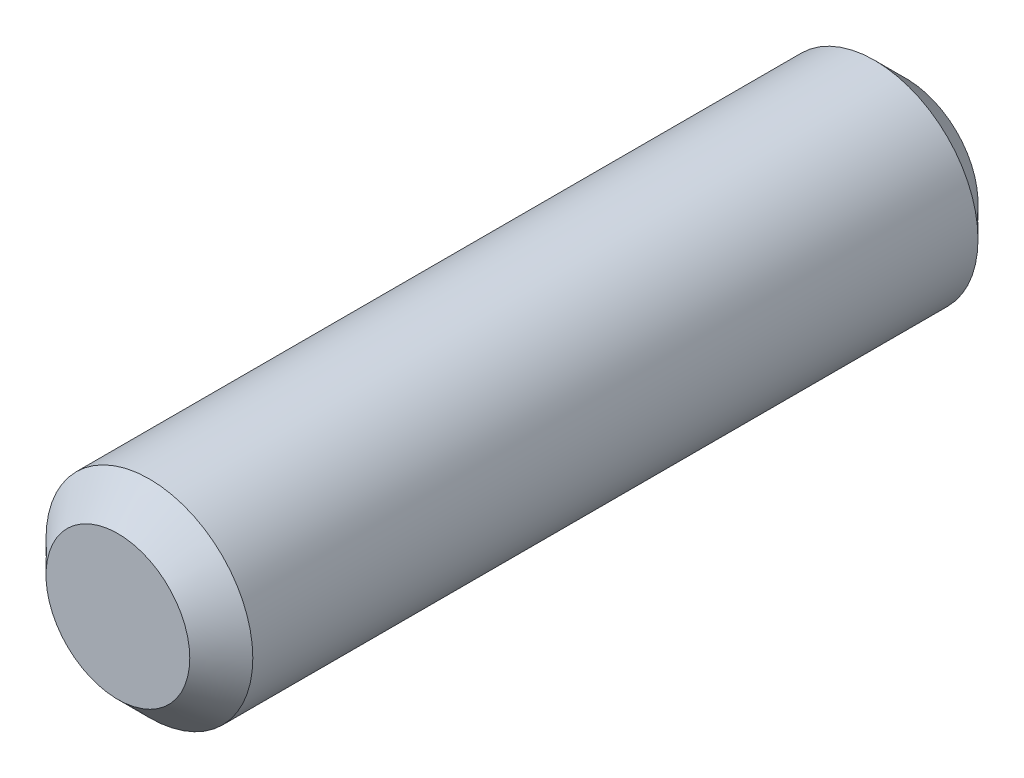
ISO-10303-21;
HEADER;
FILE_DESCRIPTION(('STEP AP214'),'2;1');
FILE_NAME('part.step','',(''),(''),'','','');
FILE_SCHEMA(('AUTOMOTIVE_DESIGN { 1 0 10303 214 1 1 1 1 }'));
ENDSEC;
DATA;
#1=APPLICATION_CONTEXT('core data for automotive mechanical design processes');
#2=APPLICATION_PROTOCOL_DEFINITION('international standard','automotive_design',2000,#1);
#3=PRODUCT_CONTEXT('',#1,'mechanical');
#4=PRODUCT('Part','Part','',(#3));
#5=PRODUCT_RELATED_PRODUCT_CATEGORY('part','',(#4));
#6=PRODUCT_DEFINITION_FORMATION('','',#4);
#7=PRODUCT_DEFINITION_CONTEXT('part definition',#1,'design');
#8=PRODUCT_DEFINITION('design','',#6,#7);
#9=PRODUCT_DEFINITION_SHAPE('','',#8);
#10=(LENGTH_UNIT() NAMED_UNIT(*) SI_UNIT(.MILLI.,.METRE.));
#11=(NAMED_UNIT(*) PLANE_ANGLE_UNIT() SI_UNIT($,.RADIAN.));
#12=(NAMED_UNIT(*) SI_UNIT($,.STERADIAN.) SOLID_ANGLE_UNIT());
#13=UNCERTAINTY_MEASURE_WITH_UNIT(LENGTH_MEASURE(1.E-05),#10,'distance_accuracy_value','');
#14=(GEOMETRIC_REPRESENTATION_CONTEXT(3) GLOBAL_UNCERTAINTY_ASSIGNED_CONTEXT((#13)) GLOBAL_UNIT_ASSIGNED_CONTEXT((#10,
#11,#12)) REPRESENTATION_CONTEXT('',''));
#15=CARTESIAN_POINT('',(0.,0.,0.));
#16=DIRECTION('',(0.,0.,1.));
#17=DIRECTION('',(1.,0.,0.));
#18=AXIS2_PLACEMENT_3D('',#15,#16,#17);
#19=CARTESIAN_POINT('',(-4.7625,1.11022302462516E-13,-6.24999999999998));
#20=DIRECTION('',(0.,0.,-0.999999999999999));
#21=DIRECTION('',(1.,0.,0.));
#22=AXIS2_PLACEMENT_3D('',#19,#20,#21);
#23=PLANE('',#22);
#24=CARTESIAN_POINT('',(-4.7625,1.11022302462516E-13,-6.24999999996589));
#25=DIRECTION('',(0.,0.,-0.999999999999999));
#26=DIRECTION('',(-1.,0.,0.));
#27=AXIS2_PLACEMENT_3D('',#24,#25,#26);
#28=CIRCLE('',#27,1.14000000005099);
#29=CARTESIAN_POINT('',(-5.90250000005099,1.10990661106312E-13,-6.24999999996589));
#30=VERTEX_POINT('',#29);
#31=EDGE_CURVE('E36',#30,#30,#28,.T.);
#32=ORIENTED_EDGE('',*,*,#31,.T.);
#33=EDGE_LOOP('',(#32));
#34=FACE_BOUND('',#33,.T.);
#35=ADVANCED_FACE('F33',(#34),#23,.T.);
#36=CARTESIAN_POINT('',(-4.76250000000009,0.,6.24999999999998));
#37=DIRECTION('',(0.,0.,-0.999999999999999));
#38=DIRECTION('',(1.,0.,0.));
#39=AXIS2_PLACEMENT_3D('',#36,#37,#38);
#40=PLANE('',#39);
#41=CARTESIAN_POINT('',(-4.76250000000009,0.,6.24999999996589));
#42=DIRECTION('',(0.,0.,0.999999999999999));
#43=DIRECTION('',(1.,0.,0.));
#44=AXIS2_PLACEMENT_3D('',#41,#42,#43);
#45=CIRCLE('',#44,1.14000000005099);
#46=CARTESIAN_POINT('',(-3.6224999999491,0.,6.24999999996589));
#47=VERTEX_POINT('',#46);
#48=EDGE_CURVE('E45',#47,#47,#45,.T.);
#49=ORIENTED_EDGE('',*,*,#48,.T.);
#50=EDGE_LOOP('',(#49));
#51=FACE_BOUND('',#50,.T.);
#52=ADVANCED_FACE('F57',(#51),#40,.F.);
#53=CARTESIAN_POINT('',(-4.7625,1.11022302462516E-13,-5.75000000014825));
#54=DIRECTION('',(0.,0.,0.999999999999999));
#55=DIRECTION('',(-1.,0.,0.));
#56=AXIS2_PLACEMENT_3D('',#53,#54,#55);
#57=CONICAL_SURFACE('',#56,1.63999999986863,0.785398163397448);
#58=CARTESIAN_POINT('',(-4.7625,1.11022302462516E-13,-5.74999999999998));
#59=DIRECTION('',(0.,0.,0.999999999999999));
#60=DIRECTION('',(1.,0.,0.));
#61=AXIS2_PLACEMENT_3D('',#58,#59,#60);
#62=CIRCLE('',#61,1.64);
#63=CARTESIAN_POINT('',(-6.40250000001691,1.10976783318506E-13,-5.74999999999998));
#64=VERTEX_POINT('',#63);
#65=EDGE_CURVE('E40',#64,#64,#62,.F.);
#66=CARTESIAN_POINT('',(-6.40250000001691,1.10976783318506E-13,-5.74999999999998));
#67=CARTESIAN_POINT('',(-6.39729166668393,1.10976927878795E-13,-5.75520833333296));
#68=CARTESIAN_POINT('',(-6.39208333335095,1.10977072439085E-13,-5.76041666666593));
#69=CARTESIAN_POINT('',(-6.38166666668499,1.10977361559664E-13,-5.77083333333189));
#70=CARTESIAN_POINT('',(-6.37645833335201,1.10977506119954E-13,-5.77604166666487));
#71=CARTESIAN_POINT('',(-6.36604166668606,1.10977795240533E-13,-5.78645833333082));
#72=CARTESIAN_POINT('',(-6.36083333335308,1.10977939800823E-13,-5.7916666666638));
#73=CARTESIAN_POINT('',(-6.35041666668712,1.10978228921402E-13,-5.80208333332976));
#74=CARTESIAN_POINT('',(-6.34520833335414,1.10978373481692E-13,-5.80729166666274));
#75=CARTESIAN_POINT('',(-6.33479166668819,1.10978662602271E-13,-5.81770833332869));
#76=CARTESIAN_POINT('',(-6.32958333335521,1.10978807162561E-13,-5.82291666666167));
#77=CARTESIAN_POINT('',(-6.31916666668925,1.1097909628314E-13,-5.83333333332763));
#78=CARTESIAN_POINT('',(-6.31395833335627,1.1097924084343E-13,-5.83854166666061));
#79=CARTESIAN_POINT('',(-6.30354166669032,1.10979529964009E-13,-5.84895833332657));
#80=CARTESIAN_POINT('',(-6.29833333335734,1.10979674524299E-13,-5.85416666665954));
#81=CARTESIAN_POINT('',(-6.28791666669138,1.10979963644878E-13,-5.8645833333255));
#82=CARTESIAN_POINT('',(-6.2827083333584,1.10980108205168E-13,-5.86979166665848));
#83=CARTESIAN_POINT('',(-6.27229166669245,1.10980397325747E-13,-5.88020833332443));
#84=CARTESIAN_POINT('',(-6.26708333335947,1.10980541886037E-13,-5.88541666665741));
#85=CARTESIAN_POINT('',(-6.25666666669351,1.10980831006616E-13,-5.89583333332337));
#86=CARTESIAN_POINT('',(-6.25145833336054,1.10980975566906E-13,-5.90104166665635));
#87=CARTESIAN_POINT('',(-6.24104166669458,1.10981264687485E-13,-5.9114583333223));
#88=CARTESIAN_POINT('',(-6.2358333333616,1.10981409247774E-13,-5.91666666665528));
#89=CARTESIAN_POINT('',(-6.22541666669564,1.10981698368354E-13,-5.92708333332124));
#90=CARTESIAN_POINT('',(-6.22020833336266,1.10981842928643E-13,-5.93229166665422));
#91=CARTESIAN_POINT('',(-6.20979166669671,1.10982132049223E-13,-5.94270833332017));
#92=CARTESIAN_POINT('',(-6.20458333336373,1.10982276609512E-13,-5.94791666665315));
#93=CARTESIAN_POINT('',(-6.19416666669777,1.10982565730092E-13,-5.95833333331911));
#94=CARTESIAN_POINT('',(-6.1889583333648,1.10982710290381E-13,-5.96354166665209));
#95=CARTESIAN_POINT('',(-6.17854166669884,1.10982999410961E-13,-5.97395833331804));
#96=CARTESIAN_POINT('',(-6.17333333336586,1.1098314397125E-13,-5.97916666665102));
#97=CARTESIAN_POINT('',(-6.1629166666999,1.1098343309183E-13,-5.98958333331698));
#98=CARTESIAN_POINT('',(-6.15770833336693,1.10983577652119E-13,-5.99479166664996));
#99=CARTESIAN_POINT('',(-6.14729166670097,1.10983866772699E-13,-6.00520833331591));
#100=CARTESIAN_POINT('',(-6.14208333336799,1.10984011332988E-13,-6.01041666664889));
#101=CARTESIAN_POINT('',(-6.13166666670203,1.10984300453568E-13,-6.02083333331485));
#102=CARTESIAN_POINT('',(-6.12645833336906,1.10984445013857E-13,-6.02604166664783));
#103=CARTESIAN_POINT('',(-6.1160416667031,1.10984734134437E-13,-6.03645833331378));
#104=CARTESIAN_POINT('',(-6.11083333337012,1.10984878694726E-13,-6.04166666664676));
#105=CARTESIAN_POINT('',(-6.10041666670416,1.10985167815306E-13,-6.05208333331272));
#106=CARTESIAN_POINT('',(-6.09520833337119,1.10985312375595E-13,-6.0572916666457));
#107=CARTESIAN_POINT('',(-6.08479166670523,1.10985601496174E-13,-6.06770833331165));
#108=CARTESIAN_POINT('',(-6.07958333337225,1.10985746056464E-13,-6.07291666664463));
#109=CARTESIAN_POINT('',(-6.0691666667063,1.10986035177043E-13,-6.08333333331059));
#110=CARTESIAN_POINT('',(-6.06395833337332,1.10986179737333E-13,-6.08854166664357));
#111=CARTESIAN_POINT('',(-6.05354166670736,1.10986468857912E-13,-6.09895833330952));
#112=CARTESIAN_POINT('',(-6.04833333337438,1.10986613418202E-13,-6.1041666666425));
#113=CARTESIAN_POINT('',(-6.03791666670843,1.10986902538781E-13,-6.11458333330846));
#114=CARTESIAN_POINT('',(-6.03270833337545,1.10987047099071E-13,-6.11979166664144));
#115=CARTESIAN_POINT('',(-6.02229166670949,1.1098733621965E-13,-6.13020833330739));
#116=CARTESIAN_POINT('',(-6.01708333337651,1.1098748077994E-13,-6.13541666664037));
#117=CARTESIAN_POINT('',(-6.00666666671056,1.10987769900519E-13,-6.14583333330633));
#118=CARTESIAN_POINT('',(-6.00145833337758,1.10987914460809E-13,-6.15104166663931));
#119=CARTESIAN_POINT('',(-5.99104166671162,1.10988203581388E-13,-6.16145833330526));
#120=CARTESIAN_POINT('',(-5.98583333337864,1.10988348141678E-13,-6.16666666663824));
#121=CARTESIAN_POINT('',(-5.97541666671269,1.10988637262257E-13,-6.1770833333042));
#122=CARTESIAN_POINT('',(-5.97020833337971,1.10988781822547E-13,-6.18229166663718));
#123=CARTESIAN_POINT('',(-5.95979166671375,1.10989070943126E-13,-6.19270833330313));
#124=CARTESIAN_POINT('',(-5.95458333338077,1.10989215503416E-13,-6.19791666663611));
#125=CARTESIAN_POINT('',(-5.94416666671482,1.10989504623995E-13,-6.20833333330207));
#126=CARTESIAN_POINT('',(-5.93895833338184,1.10989649184285E-13,-6.21354166663505));
#127=CARTESIAN_POINT('',(-5.92854166671588,1.10989938304864E-13,-6.223958333301));
#128=CARTESIAN_POINT('',(-5.9233333333829,1.10990082865154E-13,-6.22916666663398));
#129=CARTESIAN_POINT('',(-5.91291666671695,1.10990371985733E-13,-6.23958333329994));
#130=CARTESIAN_POINT('',(-5.90770833338397,1.10990516546023E-13,-6.24479166663292));
#131=CARTESIAN_POINT('',(-5.90250000005099,1.10990661106312E-13,-6.24999999996589));
#132=B_SPLINE_CURVE_WITH_KNOTS('',3,(#66,#67,#68,#69,#70,#71,#72,#73,#74,#75,#76,#77,#78,#79,
#80,#81,#82,#83,#84,#85,#86,#87,#88,#89,#90,#91,#92,#93,#94,#95,#96,#97,#98,#99,#100,#101,#102,
#103,#104,#105,#106,#107,#108,#109,#110,#111,#112,#113,#114,#115,#116,#117,#118,#119,#120,#121,
#122,#123,#124,#125,#126,#127,#128,#129,#130,#131),.UNSPECIFIED.,.F.,.F.,(4,2,2,2,2,2,2,2,2,2,2,
2,2,2,2,2,2,2,2,2,2,2,2,2,2,2,2,2,2,2,2,2,4),(0.,0.0220970869105739,0.0441941738211473,
0.0662912607317206,0.0883883476422939,0.110485434552867,0.132582521463441,0.154679608374014,
0.176776695284587,0.19887378219516,0.220970869105734,0.243067956016307,0.26516504292688,
0.287262129837453,0.309359216748027,0.3314563036586,0.353553390569174,0.375650477479747,
0.39774756439032,0.419844651300894,0.441941738211467,0.46403882512204,0.486135912032614,
0.508232998943187,0.53033008585376,0.552427172764334,0.574524259674906,0.59662134658548,
0.618718433496054,0.640815520406627,0.6629126073172,0.685009694227774,0.707106781138347),.UNSPECIFIED.);
#133=EDGE_CURVE('BSEAM54',#64,#30,#132,.T.);
#134=ORIENTED_EDGE('',*,*,#65,.T.);
#135=ORIENTED_EDGE('',*,*,#31,.F.);
#136=ORIENTED_EDGE('',*,*,#133,.T.);
#137=ORIENTED_EDGE('',*,*,#133,.F.);
#138=EDGE_LOOP('',(#134,#136,#135,#137));
#139=FACE_BOUND('',#138,.T.);
#140=ADVANCED_FACE('F54',(#139),#57,.T.);
#141=CARTESIAN_POINT('',(-4.76250000000009,0.,5.75000000014825));
#142=DIRECTION('',(0.,0.,-0.999999999999999));
#143=DIRECTION('',(1.,0.,0.));
#144=AXIS2_PLACEMENT_3D('',#141,#142,#143);
#145=CONICAL_SURFACE('',#144,1.63999999986863,0.785398163397448);
#146=CARTESIAN_POINT('',(-4.76250000000009,0.,5.74999999999998));
#147=DIRECTION('',(0.,0.,0.999999999999999));
#148=DIRECTION('',(1.,0.,0.));
#149=AXIS2_PLACEMENT_3D('',#146,#147,#148);
#150=CIRCLE('',#149,1.64);
#151=CARTESIAN_POINT('',(-3.12249999998318,0.,5.74999999999998));
#152=VERTEX_POINT('',#151);
#153=EDGE_CURVE('E10',#152,#152,#150,.T.);
#154=CARTESIAN_POINT('',(-3.12249999998318,0.,5.74999999999998));
#155=CARTESIAN_POINT('',(-3.12770833331616,0.,5.75520833333296));
#156=CARTESIAN_POINT('',(-3.13291666664914,0.,5.76041666666593));
#157=CARTESIAN_POINT('',(-3.1433333333151,0.,5.77083333333189));
#158=CARTESIAN_POINT('',(-3.14854166664807,0.,5.77604166666487));
#159=CARTESIAN_POINT('',(-3.15895833331403,0.,5.78645833333082));
#160=CARTESIAN_POINT('',(-3.16416666664701,0.,5.7916666666638));
#161=CARTESIAN_POINT('',(-3.17458333331297,0.,5.80208333332976));
#162=CARTESIAN_POINT('',(-3.17979166664594,0.,5.80729166666274));
#163=CARTESIAN_POINT('',(-3.1902083333119,0.,5.81770833332869));
#164=CARTESIAN_POINT('',(-3.19541666664488,0.,5.82291666666167));
#165=CARTESIAN_POINT('',(-3.20583333331084,0.,5.83333333332763));
#166=CARTESIAN_POINT('',(-3.21104166664381,0.,5.83854166666061));
#167=CARTESIAN_POINT('',(-3.22145833330977,0.,5.84895833332657));
#168=CARTESIAN_POINT('',(-3.22666666664275,0.,5.85416666665954));
#169=CARTESIAN_POINT('',(-3.23708333330871,0.,5.8645833333255));
#170=CARTESIAN_POINT('',(-3.24229166664168,0.,5.86979166665848));
#171=CARTESIAN_POINT('',(-3.25270833330764,0.,5.88020833332443));
#172=CARTESIAN_POINT('',(-3.25791666664062,0.,5.88541666665741));
#173=CARTESIAN_POINT('',(-3.26833333330658,0.,5.89583333332337));
#174=CARTESIAN_POINT('',(-3.27354166663955,0.,5.90104166665635));
#175=CARTESIAN_POINT('',(-3.28395833330551,0.,5.9114583333223));
#176=CARTESIAN_POINT('',(-3.28916666663849,0.,5.91666666665528));
#177=CARTESIAN_POINT('',(-3.29958333330445,0.,5.92708333332124));
#178=CARTESIAN_POINT('',(-3.30479166663742,0.,5.93229166665422));
#179=CARTESIAN_POINT('',(-3.31520833330338,0.,5.94270833332017));
#180=CARTESIAN_POINT('',(-3.32041666663636,0.,5.94791666665315));
#181=CARTESIAN_POINT('',(-3.33083333330232,0.,5.95833333331911));
#182=CARTESIAN_POINT('',(-3.33604166663529,0.,5.96354166665209));
#183=CARTESIAN_POINT('',(-3.34645833330125,0.,5.97395833331804));
#184=CARTESIAN_POINT('',(-3.35166666663423,0.,5.97916666665102));
#185=CARTESIAN_POINT('',(-3.36208333330018,0.,5.98958333331698));
#186=CARTESIAN_POINT('',(-3.36729166663316,0.,5.99479166664996));
#187=CARTESIAN_POINT('',(-3.37770833329912,0.,6.00520833331591));
#188=CARTESIAN_POINT('',(-3.3829166666321,0.,6.01041666664889));
#189=CARTESIAN_POINT('',(-3.39333333329805,0.,6.02083333331485));
#190=CARTESIAN_POINT('',(-3.39854166663103,0.,6.02604166664783));
#191=CARTESIAN_POINT('',(-3.40895833329699,0.,6.03645833331378));
#192=CARTESIAN_POINT('',(-3.41416666662997,0.,6.04166666664676));
#193=CARTESIAN_POINT('',(-3.42458333329592,0.,6.05208333331272));
#194=CARTESIAN_POINT('',(-3.4297916666289,0.,6.0572916666457));
#195=CARTESIAN_POINT('',(-3.44020833329486,0.,6.06770833331165));
#196=CARTESIAN_POINT('',(-3.44541666662784,0.,6.07291666664463));
#197=CARTESIAN_POINT('',(-3.45583333329379,0.,6.08333333331059));
#198=CARTESIAN_POINT('',(-3.46104166662677,0.,6.08854166664357));
#199=CARTESIAN_POINT('',(-3.47145833329273,0.,6.09895833330952));
#200=CARTESIAN_POINT('',(-3.47666666662571,0.,6.1041666666425));
#201=CARTESIAN_POINT('',(-3.48708333329166,0.,6.11458333330846));
#202=CARTESIAN_POINT('',(-3.49229166662464,0.,6.11979166664144));
#203=CARTESIAN_POINT('',(-3.5027083332906,0.,6.13020833330739));
#204=CARTESIAN_POINT('',(-3.50791666662358,0.,6.13541666664037));
#205=CARTESIAN_POINT('',(-3.51833333328953,0.,6.14583333330633));
#206=CARTESIAN_POINT('',(-3.52354166662251,0.,6.15104166663931));
#207=CARTESIAN_POINT('',(-3.53395833328847,0.,6.16145833330526));
#208=CARTESIAN_POINT('',(-3.53916666662145,0.,6.16666666663824));
#209=CARTESIAN_POINT('',(-3.5495833332874,0.,6.1770833333042));
#210=CARTESIAN_POINT('',(-3.55479166662038,0.,6.18229166663718));
#211=CARTESIAN_POINT('',(-3.56520833328634,0.,6.19270833330313));
#212=CARTESIAN_POINT('',(-3.57041666661932,0.,6.19791666663611));
#213=CARTESIAN_POINT('',(-3.58083333328527,0.,6.20833333330207));
#214=CARTESIAN_POINT('',(-3.58604166661825,0.,6.21354166663505));
#215=CARTESIAN_POINT('',(-3.59645833328421,0.,6.223958333301));
#216=CARTESIAN_POINT('',(-3.60166666661719,0.,6.22916666663398));
#217=CARTESIAN_POINT('',(-3.61208333328314,0.,6.23958333329994));
#218=CARTESIAN_POINT('',(-3.61729166661612,0.,6.24479166663292));
#219=CARTESIAN_POINT('',(-3.6224999999491,0.,6.24999999996589));
#220=B_SPLINE_CURVE_WITH_KNOTS('',3,(#154,#155,#156,#157,#158,#159,#160,#161,#162,#163,#164,
#165,#166,#167,#168,#169,#170,#171,#172,#173,#174,#175,#176,#177,#178,#179,#180,#181,#182,#183,
#184,#185,#186,#187,#188,#189,#190,#191,#192,#193,#194,#195,#196,#197,#198,#199,#200,#201,#202,
#203,#204,#205,#206,#207,#208,#209,#210,#211,#212,#213,#214,#215,#216,#217,#218,#219),
.UNSPECIFIED.,.F.,.F.,(4,2,2,2,2,2,2,2,2,2,2,2,2,2,2,2,2,2,2,2,2,2,2,2,2,2,2,2,2,2,2,2,4),(0.,
0.0220970869105739,0.0441941738211473,0.0662912607317206,0.0883883476422939,0.110485434552867,
0.132582521463441,0.154679608374014,0.176776695284587,0.19887378219516,0.220970869105734,
0.243067956016307,0.26516504292688,0.287262129837453,0.309359216748027,0.3314563036586,
0.353553390569174,0.375650477479747,0.39774756439032,0.419844651300894,0.441941738211467,
0.46403882512204,0.486135912032614,0.508232998943187,0.53033008585376,0.552427172764334,
0.574524259674906,0.59662134658548,0.618718433496054,0.640815520406627,0.6629126073172,
0.685009694227774,0.707106781138347),.UNSPECIFIED.);
#221=EDGE_CURVE('BSEAM56',#152,#47,#220,.T.);
#222=ORIENTED_EDGE('',*,*,#153,.T.);
#223=ORIENTED_EDGE('',*,*,#48,.F.);
#224=ORIENTED_EDGE('',*,*,#221,.T.);
#225=ORIENTED_EDGE('',*,*,#221,.F.);
#226=EDGE_LOOP('',(#222,#224,#223,#225));
#227=FACE_BOUND('',#226,.T.);
#228=ADVANCED_FACE('F56',(#227),#145,.T.);
#229=CARTESIAN_POINT('',(-4.76250000000009,0.,6.24999999999998));
#230=DIRECTION('',(0.,0.,-0.999999999999999));
#231=DIRECTION('',(1.,0.,0.));
#232=AXIS2_PLACEMENT_3D('',#229,#230,#231);
#233=CYLINDRICAL_SURFACE('',#232,1.64);
#234=ORIENTED_EDGE('',*,*,#65,.F.);
#235=EDGE_LOOP('',(#234));
#236=FACE_BOUND('',#235,.T.);
#237=ORIENTED_EDGE('',*,*,#153,.F.);
#238=EDGE_LOOP('',(#237));
#239=FACE_BOUND('',#238,.T.);
#240=ADVANCED_FACE('F64',(#236,#239),#233,.T.);
#241=CLOSED_SHELL('',(#35,#52,#140,#228,#240));
#242=MANIFOLD_SOLID_BREP('B2',#241);
#243=ADVANCED_BREP_SHAPE_REPRESENTATION('',(#18,#242),#14);
#244=SHAPE_DEFINITION_REPRESENTATION(#9,#243);
ENDSEC;
END-ISO-10303-21;
